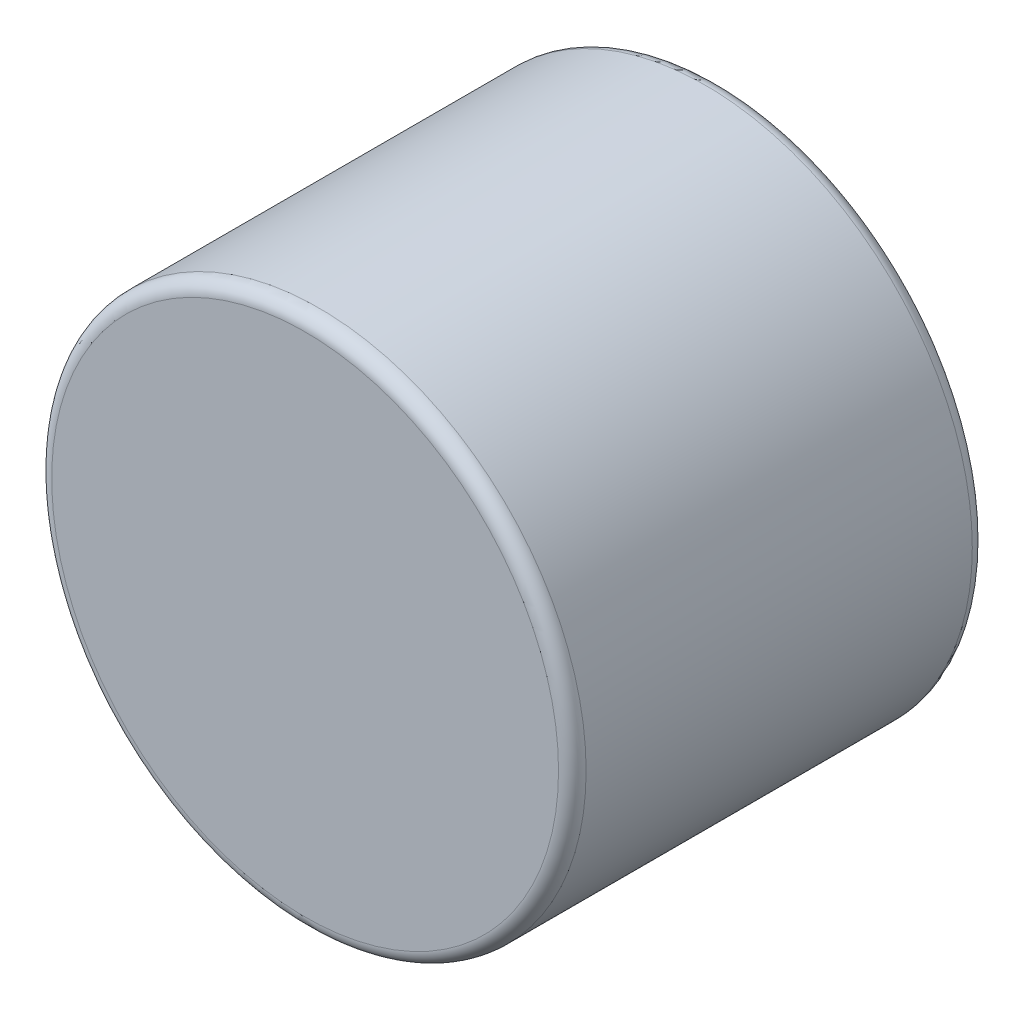
ISO-10303-21;
HEADER;
FILE_DESCRIPTION(('STEP AP214'),'2;1');
FILE_NAME('part.step','',(''),(''),'','','');
FILE_SCHEMA(('AUTOMOTIVE_DESIGN { 1 0 10303 214 1 1 1 1 }'));
ENDSEC;
DATA;
#1=APPLICATION_CONTEXT('core data for automotive mechanical design processes');
#2=APPLICATION_PROTOCOL_DEFINITION('international standard','automotive_design',2000,#1);
#3=PRODUCT_CONTEXT('',#1,'mechanical');
#4=PRODUCT('Part','Part','',(#3));
#5=PRODUCT_RELATED_PRODUCT_CATEGORY('part','',(#4));
#6=PRODUCT_DEFINITION_FORMATION('','',#4);
#7=PRODUCT_DEFINITION_CONTEXT('part definition',#1,'design');
#8=PRODUCT_DEFINITION('design','',#6,#7);
#9=PRODUCT_DEFINITION_SHAPE('','',#8);
#10=(LENGTH_UNIT() NAMED_UNIT(*) SI_UNIT(.MILLI.,.METRE.));
#11=(NAMED_UNIT(*) PLANE_ANGLE_UNIT() SI_UNIT($,.RADIAN.));
#12=(NAMED_UNIT(*) SI_UNIT($,.STERADIAN.) SOLID_ANGLE_UNIT());
#13=UNCERTAINTY_MEASURE_WITH_UNIT(LENGTH_MEASURE(1.E-05),#10,'distance_accuracy_value','');
#14=(GEOMETRIC_REPRESENTATION_CONTEXT(3) GLOBAL_UNCERTAINTY_ASSIGNED_CONTEXT((#13)) GLOBAL_UNIT_ASSIGNED_CONTEXT((#10,
#11,#12)) REPRESENTATION_CONTEXT('',''));
#15=CARTESIAN_POINT('',(0.,0.,0.));
#16=DIRECTION('',(0.,0.,1.));
#17=DIRECTION('',(1.,0.,0.));
#18=AXIS2_PLACEMENT_3D('',#15,#16,#17);
#19=CARTESIAN_POINT('',(0.,0.,76.2));
#20=DIRECTION('',(0.,0.,-1.));
#21=DIRECTION('',(-1.,0.,0.));
#22=AXIS2_PLACEMENT_3D('',#19,#20,#21);
#23=CYLINDRICAL_SURFACE('',#22,49.2125);
#24=CARTESIAN_POINT('',(0.,0.,2.54));
#25=DIRECTION('',(0.,0.,1.));
#26=DIRECTION('',(1.,0.,0.));
#27=AXIS2_PLACEMENT_3D('',#24,#25,#26);
#28=CIRCLE('',#27,49.2125);
#29=CARTESIAN_POINT('',(-49.2125,0.,2.53999999999999));
#30=VERTEX_POINT('',#29);
#31=EDGE_CURVE('E49',#30,#30,#28,.T.);
#32=CARTESIAN_POINT('',(0.,0.,73.66));
#33=DIRECTION('',(0.,0.,1.));
#34=DIRECTION('',(1.,0.,0.));
#35=AXIS2_PLACEMENT_3D('',#32,#33,#34);
#36=CIRCLE('',#35,49.2125);
#37=CARTESIAN_POINT('',(-49.2125,0.,73.66));
#38=VERTEX_POINT('',#37);
#39=EDGE_CURVE('E53',#38,#38,#36,.F.);
#40=CARTESIAN_POINT('',(-49.2125,0.,2.53999999999999));
#41=CARTESIAN_POINT('',(-49.2125,0.,3.28083333333332));
#42=CARTESIAN_POINT('',(-49.2125,0.,4.02166666666665));
#43=CARTESIAN_POINT('',(-49.2125,0.,5.50333333333332));
#44=CARTESIAN_POINT('',(-49.2125,0.,6.24416666666666));
#45=CARTESIAN_POINT('',(-49.2125,0.,7.72583333333333));
#46=CARTESIAN_POINT('',(-49.2125,0.,8.46666666666666));
#47=CARTESIAN_POINT('',(-49.2125,0.,9.94833333333333));
#48=CARTESIAN_POINT('',(-49.2125,0.,10.6891666666667));
#49=CARTESIAN_POINT('',(-49.2125,0.,12.1708333333333));
#50=CARTESIAN_POINT('',(-49.2125,0.,12.9116666666667));
#51=CARTESIAN_POINT('',(-49.2125,0.,14.3933333333333));
#52=CARTESIAN_POINT('',(-49.2125,0.,15.1341666666666));
#53=CARTESIAN_POINT('',(-49.2125,0.,16.6158333333333));
#54=CARTESIAN_POINT('',(-49.2125,0.,17.3566666666666));
#55=CARTESIAN_POINT('',(-49.2125,0.,18.8383333333333));
#56=CARTESIAN_POINT('',(-49.2125,0.,19.5791666666667));
#57=CARTESIAN_POINT('',(-49.2125,0.,21.0608333333333));
#58=CARTESIAN_POINT('',(-49.2125,0.,21.8016666666667));
#59=CARTESIAN_POINT('',(-49.2125,0.,23.2833333333333));
#60=CARTESIAN_POINT('',(-49.2125,0.,24.0241666666667));
#61=CARTESIAN_POINT('',(-49.2125,0.,25.5058333333333));
#62=CARTESIAN_POINT('',(-49.2125,0.,26.2466666666667));
#63=CARTESIAN_POINT('',(-49.2125,0.,27.7283333333333));
#64=CARTESIAN_POINT('',(-49.2125,0.,28.4691666666667));
#65=CARTESIAN_POINT('',(-49.2125,0.,29.9508333333333));
#66=CARTESIAN_POINT('',(-49.2125,0.,30.6916666666667));
#67=CARTESIAN_POINT('',(-49.2125,0.,32.1733333333333));
#68=CARTESIAN_POINT('',(-49.2125,0.,32.9141666666667));
#69=CARTESIAN_POINT('',(-49.2125,0.,34.3958333333333));
#70=CARTESIAN_POINT('',(-49.2125,0.,35.1366666666666));
#71=CARTESIAN_POINT('',(-49.2125,0.,36.6183333333333));
#72=CARTESIAN_POINT('',(-49.2125,0.,37.3591666666667));
#73=CARTESIAN_POINT('',(-49.2125,0.,38.8408333333333));
#74=CARTESIAN_POINT('',(-49.2125,0.,39.5816666666667));
#75=CARTESIAN_POINT('',(-49.2125,0.,41.0633333333333));
#76=CARTESIAN_POINT('',(-49.2125,0.,41.8041666666667));
#77=CARTESIAN_POINT('',(-49.2125,0.,43.2858333333333));
#78=CARTESIAN_POINT('',(-49.2125,0.,44.0266666666667));
#79=CARTESIAN_POINT('',(-49.2125,0.,45.5083333333333));
#80=CARTESIAN_POINT('',(-49.2125,0.,46.2491666666667));
#81=CARTESIAN_POINT('',(-49.2125,0.,47.7308333333333));
#82=CARTESIAN_POINT('',(-49.2125,0.,48.4716666666667));
#83=CARTESIAN_POINT('',(-49.2125,0.,49.9533333333333));
#84=CARTESIAN_POINT('',(-49.2125,0.,50.6941666666667));
#85=CARTESIAN_POINT('',(-49.2125,0.,52.1758333333333));
#86=CARTESIAN_POINT('',(-49.2125,0.,52.9166666666667));
#87=CARTESIAN_POINT('',(-49.2125,0.,54.3983333333333));
#88=CARTESIAN_POINT('',(-49.2125,0.,55.1391666666666));
#89=CARTESIAN_POINT('',(-49.2125,0.,56.6208333333333));
#90=CARTESIAN_POINT('',(-49.2125,0.,57.3616666666667));
#91=CARTESIAN_POINT('',(-49.2125,0.,58.8433333333333));
#92=CARTESIAN_POINT('',(-49.2125,0.,59.5841666666667));
#93=CARTESIAN_POINT('',(-49.2125,0.,61.0658333333333));
#94=CARTESIAN_POINT('',(-49.2125,0.,61.8066666666667));
#95=CARTESIAN_POINT('',(-49.2125,0.,63.2883333333333));
#96=CARTESIAN_POINT('',(-49.2125,0.,64.0291666666667));
#97=CARTESIAN_POINT('',(-49.2125,0.,65.5108333333333));
#98=CARTESIAN_POINT('',(-49.2125,0.,66.2516666666667));
#99=CARTESIAN_POINT('',(-49.2125,0.,67.7333333333333));
#100=CARTESIAN_POINT('',(-49.2125,0.,68.4741666666667));
#101=CARTESIAN_POINT('',(-49.2125,0.,69.9558333333333));
#102=CARTESIAN_POINT('',(-49.2125,0.,70.6966666666667));
#103=CARTESIAN_POINT('',(-49.2125,0.,72.1783333333333));
#104=CARTESIAN_POINT('',(-49.2125,0.,72.9191666666667));
#105=CARTESIAN_POINT('',(-49.2125,0.,73.66));
#106=B_SPLINE_CURVE_WITH_KNOTS('',3,(#40,#41,#42,#43,#44,#45,#46,#47,#48,#49,#50,#51,#52,#53,
#54,#55,#56,#57,#58,#59,#60,#61,#62,#63,#64,#65,#66,#67,#68,#69,#70,#71,#72,#73,#74,#75,#76,#77,
#78,#79,#80,#81,#82,#83,#84,#85,#86,#87,#88,#89,#90,#91,#92,#93,#94,#95,#96,#97,#98,#99,#100,
#101,#102,#103,#104,#105),.UNSPECIFIED.,.F.,.F.,(4,2,2,2,2,2,2,2,2,2,2,2,2,2,2,2,2,2,2,2,2,2,2,
2,2,2,2,2,2,2,2,2,4),(0.,2.2225,4.445,6.66750000000001,8.89000000000001,11.1125,13.335,15.5575,
17.78,20.0025,22.225,24.4475,26.67,28.8925,31.115,33.3375,35.56,37.7825,40.005,42.2275,44.45,
46.6725,48.895,51.1175,53.34,55.5625,57.785,60.0075,62.23,64.4525,66.675,68.8975,71.12),.UNSPECIFIED.);
#107=EDGE_CURVE('BSEAM38',#30,#38,#106,.T.);
#108=ORIENTED_EDGE('',*,*,#31,.T.);
#109=ORIENTED_EDGE('',*,*,#39,.T.);
#110=ORIENTED_EDGE('',*,*,#107,.T.);
#111=ORIENTED_EDGE('',*,*,#107,.F.);
#112=EDGE_LOOP('',(#108,#110,#109,#111));
#113=FACE_BOUND('',#112,.T.);
#114=ADVANCED_FACE('F38',(#113),#23,.T.);
#115=CARTESIAN_POINT('',(0.,0.,76.2));
#116=DIRECTION('',(0.,0.,1.));
#117=DIRECTION('',(1.,0.,0.));
#118=AXIS2_PLACEMENT_3D('',#115,#116,#117);
#119=PLANE('',#118);
#120=CARTESIAN_POINT('',(0.,0.,76.2));
#121=DIRECTION('',(0.,0.,1.));
#122=DIRECTION('',(1.,0.,0.));
#123=AXIS2_PLACEMENT_3D('',#120,#121,#122);
#124=CIRCLE('',#123,46.6725);
#125=CARTESIAN_POINT('',(46.6725,0.,76.2));
#126=VERTEX_POINT('',#125);
#127=EDGE_CURVE('E10',#126,#126,#124,.T.);
#128=ORIENTED_EDGE('',*,*,#127,.T.);
#129=EDGE_LOOP('',(#128));
#130=FACE_BOUND('',#129,.T.);
#131=ADVANCED_FACE('F69',(#130),#119,.T.);
#132=CARTESIAN_POINT('',(0.,0.,0.));
#133=DIRECTION('',(0.,0.,1.));
#134=DIRECTION('',(1.,0.,0.));
#135=AXIS2_PLACEMENT_3D('',#132,#133,#134);
#136=PLANE('',#135);
#137=CARTESIAN_POINT('',(0.,0.,0.));
#138=DIRECTION('',(0.,0.,1.));
#139=DIRECTION('',(1.,0.,0.));
#140=AXIS2_PLACEMENT_3D('',#137,#138,#139);
#141=CIRCLE('',#140,46.6725);
#142=CARTESIAN_POINT('',(46.6725,0.,0.));
#143=VERTEX_POINT('',#142);
#144=EDGE_CURVE('E45',#143,#143,#141,.F.);
#145=ORIENTED_EDGE('',*,*,#144,.T.);
#146=EDGE_LOOP('',(#145));
#147=FACE_BOUND('',#146,.T.);
#148=ADVANCED_FACE('F66',(#147),#136,.F.);
#149=CARTESIAN_POINT('',(0.,0.,2.54));
#150=DIRECTION('',(0.,0.,1.));
#151=DIRECTION('',(1.,0.,0.));
#152=AXIS2_PLACEMENT_3D('',#149,#150,#151);
#153=TOROIDAL_SURFACE('',#152,46.6725,2.54);
#154=ORIENTED_EDGE('',*,*,#144,.F.);
#155=EDGE_LOOP('',(#154));
#156=FACE_BOUND('',#155,.T.);
#157=ORIENTED_EDGE('',*,*,#31,.F.);
#158=EDGE_LOOP('',(#157));
#159=FACE_BOUND('',#158,.T.);
#160=ADVANCED_FACE('F62',(#156,#159),#153,.T.);
#161=CARTESIAN_POINT('',(0.,0.,73.66));
#162=DIRECTION('',(0.,0.,1.));
#163=DIRECTION('',(1.,0.,0.));
#164=AXIS2_PLACEMENT_3D('',#161,#162,#163);
#165=TOROIDAL_SURFACE('',#164,46.6725,2.54);
#166=ORIENTED_EDGE('',*,*,#39,.F.);
#167=EDGE_LOOP('',(#166));
#168=FACE_BOUND('',#167,.T.);
#169=ORIENTED_EDGE('',*,*,#127,.F.);
#170=EDGE_LOOP('',(#169));
#171=FACE_BOUND('',#170,.T.);
#172=ADVANCED_FACE('F40',(#168,#171),#165,.T.);
#173=CLOSED_SHELL('',(#114,#131,#148,#160,#172));
#174=MANIFOLD_SOLID_BREP('B2',#173);
#175=ADVANCED_BREP_SHAPE_REPRESENTATION('',(#18,#174),#14);
#176=SHAPE_DEFINITION_REPRESENTATION(#9,#175);
ENDSEC;
END-ISO-10303-21;
